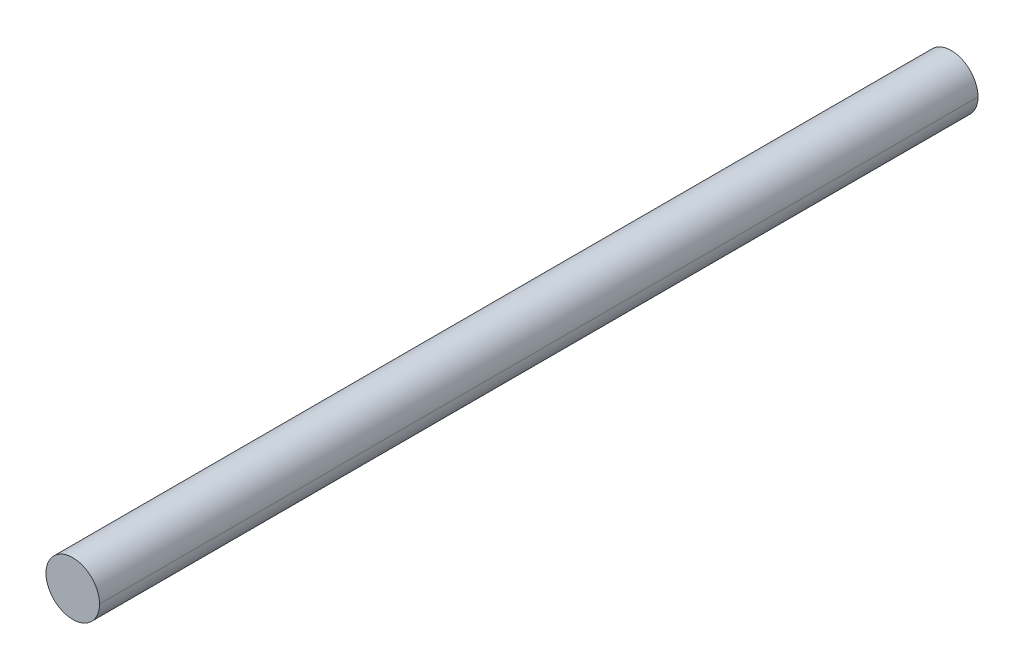
ISO-10303-21;
HEADER;
FILE_DESCRIPTION(('STEP AP214'),'2;1');
FILE_NAME('part.step','',(''),(''),'','','');
FILE_SCHEMA(('AUTOMOTIVE_DESIGN { 1 0 10303 214 1 1 1 1 }'));
ENDSEC;
DATA;
#1=APPLICATION_CONTEXT('core data for automotive mechanical design processes');
#2=APPLICATION_PROTOCOL_DEFINITION('international standard','automotive_design',2000,#1);
#3=PRODUCT_CONTEXT('',#1,'mechanical');
#4=PRODUCT('Part','Part','',(#3));
#5=PRODUCT_RELATED_PRODUCT_CATEGORY('part','',(#4));
#6=PRODUCT_DEFINITION_FORMATION('','',#4);
#7=PRODUCT_DEFINITION_CONTEXT('part definition',#1,'design');
#8=PRODUCT_DEFINITION('design','',#6,#7);
#9=PRODUCT_DEFINITION_SHAPE('','',#8);
#10=(LENGTH_UNIT() NAMED_UNIT(*) SI_UNIT(.MILLI.,.METRE.));
#11=(NAMED_UNIT(*) PLANE_ANGLE_UNIT() SI_UNIT($,.RADIAN.));
#12=(NAMED_UNIT(*) SI_UNIT($,.STERADIAN.) SOLID_ANGLE_UNIT());
#13=UNCERTAINTY_MEASURE_WITH_UNIT(LENGTH_MEASURE(1.E-05),#10,'distance_accuracy_value','');
#14=(GEOMETRIC_REPRESENTATION_CONTEXT(3) GLOBAL_UNCERTAINTY_ASSIGNED_CONTEXT((#13)) GLOBAL_UNIT_ASSIGNED_CONTEXT((#10,
#11,#12)) REPRESENTATION_CONTEXT('',''));
#15=CARTESIAN_POINT('',(0.,0.,0.));
#16=DIRECTION('',(0.,0.,1.));
#17=DIRECTION('',(1.,0.,0.));
#18=AXIS2_PLACEMENT_3D('',#15,#16,#17);
#19=CARTESIAN_POINT('',(-4.016375,-4.016375,-65.0875));
#20=DIRECTION('',(0.,0.,1.));
#21=DIRECTION('',(1.,0.,0.));
#22=AXIS2_PLACEMENT_3D('',#19,#20,#21);
#23=PLANE('',#22);
#24=CARTESIAN_POINT('',(0.,0.,-65.0875));
#25=DIRECTION('',(0.,0.,-1.));
#26=DIRECTION('',(-1.,0.,0.));
#27=AXIS2_PLACEMENT_3D('',#24,#25,#26);
#28=CIRCLE('',#27,3.96875);
#29=CARTESIAN_POINT('',(-3.96875,-3.56368462810483E-10,-65.0875));
#30=VERTEX_POINT('',#29);
#31=CARTESIAN_POINT('',(3.96875,-1.62800758261697E-09,-65.0875));
#32=VERTEX_POINT('',#31);
#33=EDGE_CURVE('E45',#30,#32,#28,.T.);
#34=ORIENTED_EDGE('',*,*,#33,.T.);
#35=CARTESIAN_POINT('',(0.,0.,-65.0875));
#36=DIRECTION('',(0.,0.,-1.));
#37=DIRECTION('',(-1.,0.,0.));
#38=AXIS2_PLACEMENT_3D('',#35,#36,#37);
#39=CIRCLE('',#38,3.96875);
#40=EDGE_CURVE('E21',#32,#30,#39,.T.);
#41=ORIENTED_EDGE('',*,*,#40,.T.);
#42=EDGE_LOOP('',(#34,#41));
#43=FACE_BOUND('',#42,.T.);
#44=ADVANCED_FACE('F17',(#43),#23,.F.);
#45=CARTESIAN_POINT('',(0.,0.,65.0875));
#46=DIRECTION('',(0.,0.,-1.));
#47=DIRECTION('',(-1.,0.,0.));
#48=AXIS2_PLACEMENT_3D('',#45,#46,#47);
#49=CYLINDRICAL_SURFACE('',#48,3.96875);
#50=CARTESIAN_POINT('',(0.,0.,65.0875));
#51=DIRECTION('',(0.,0.,-1.));
#52=DIRECTION('',(-1.,0.,0.));
#53=AXIS2_PLACEMENT_3D('',#50,#51,#52);
#54=CIRCLE('',#53,3.96875);
#55=CARTESIAN_POINT('',(-3.96875,-3.56368462810483E-10,65.0875));
#56=VERTEX_POINT('',#55);
#57=CARTESIAN_POINT('',(3.96875,-1.62800758261697E-09,65.0875));
#58=VERTEX_POINT('',#57);
#59=EDGE_CURVE('E41',#56,#58,#54,.F.);
#60=ORIENTED_EDGE('',*,*,#59,.F.);
#61=DIRECTION('',(0.,0.,1.));
#62=VECTOR('',#61,1.);
#63=CARTESIAN_POINT('',(-3.96875,0.,0.));
#64=LINE('',#63,#62);
#65=EDGE_CURVE('E47',#56,#30,#64,.F.);
#66=ORIENTED_EDGE('',*,*,#65,.T.);
#67=ORIENTED_EDGE('',*,*,#40,.F.);
#68=DIRECTION('',(0.,0.,-1.));
#69=VECTOR('',#68,1.);
#70=CARTESIAN_POINT('',(3.96875,-1.62800846385649E-09,0.));
#71=LINE('',#70,#69);
#72=EDGE_CURVE('E27',#32,#58,#71,.F.);
#73=ORIENTED_EDGE('',*,*,#72,.T.);
#74=EDGE_LOOP('',(#60,#66,#67,#73));
#75=FACE_BOUND('',#74,.T.);
#76=ADVANCED_FACE('F48',(#75),#49,.T.);
#77=CARTESIAN_POINT('',(-4.016375,-4.016375,65.0875));
#78=DIRECTION('',(0.,0.,1.));
#79=DIRECTION('',(1.,0.,0.));
#80=AXIS2_PLACEMENT_3D('',#77,#78,#79);
#81=PLANE('',#80);
#82=ORIENTED_EDGE('',*,*,#59,.T.);
#83=CARTESIAN_POINT('',(0.,0.,65.0875));
#84=DIRECTION('',(0.,0.,-1.));
#85=DIRECTION('',(-1.,0.,0.));
#86=AXIS2_PLACEMENT_3D('',#83,#84,#85);
#87=CIRCLE('',#86,3.96875);
#88=EDGE_CURVE('E11',#58,#56,#87,.F.);
#89=ORIENTED_EDGE('',*,*,#88,.T.);
#90=EDGE_LOOP('',(#82,#89));
#91=FACE_BOUND('',#90,.T.);
#92=ADVANCED_FACE('F19',(#91),#81,.T.);
#93=CARTESIAN_POINT('',(0.,0.,65.0875));
#94=DIRECTION('',(0.,0.,-1.));
#95=DIRECTION('',(-1.,0.,0.));
#96=AXIS2_PLACEMENT_3D('',#93,#94,#95);
#97=CYLINDRICAL_SURFACE('',#96,3.96875);
#98=ORIENTED_EDGE('',*,*,#72,.F.);
#99=ORIENTED_EDGE('',*,*,#33,.F.);
#100=ORIENTED_EDGE('',*,*,#65,.F.);
#101=ORIENTED_EDGE('',*,*,#88,.F.);
#102=EDGE_LOOP('',(#98,#99,#100,#101));
#103=FACE_BOUND('',#102,.T.);
#104=ADVANCED_FACE('F52',(#103),#97,.T.);
#105=CLOSED_SHELL('',(#44,#76,#92,#104));
#106=MANIFOLD_SOLID_BREP('B1',#105);
#107=ADVANCED_BREP_SHAPE_REPRESENTATION('',(#18,#106),#14);
#108=SHAPE_DEFINITION_REPRESENTATION(#9,#107);
ENDSEC;
END-ISO-10303-21;
